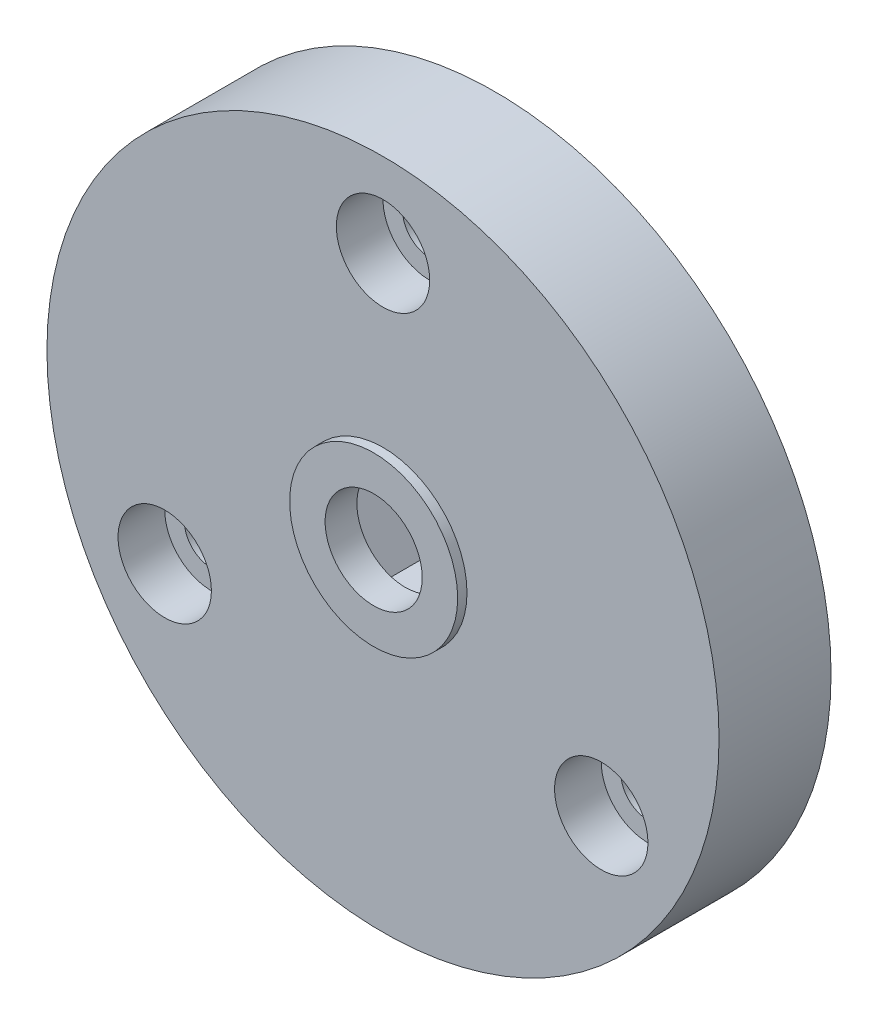
ISO-10303-21;
HEADER;
FILE_DESCRIPTION(('STEP AP214'),'2;1');
FILE_NAME('part.step','',(''),(''),'','','');
FILE_SCHEMA(('AUTOMOTIVE_DESIGN { 1 0 10303 214 1 1 1 1 }'));
ENDSEC;
DATA;
#1=APPLICATION_CONTEXT('core data for automotive mechanical design processes');
#2=APPLICATION_PROTOCOL_DEFINITION('international standard','automotive_design',2000,#1);
#3=PRODUCT_CONTEXT('',#1,'mechanical');
#4=PRODUCT('Part','Part','',(#3));
#5=PRODUCT_RELATED_PRODUCT_CATEGORY('part','',(#4));
#6=PRODUCT_DEFINITION_FORMATION('','',#4);
#7=PRODUCT_DEFINITION_CONTEXT('part definition',#1,'design');
#8=PRODUCT_DEFINITION('design','',#6,#7);
#9=PRODUCT_DEFINITION_SHAPE('','',#8);
#10=(LENGTH_UNIT() NAMED_UNIT(*) SI_UNIT(.MILLI.,.METRE.));
#11=(NAMED_UNIT(*) PLANE_ANGLE_UNIT() SI_UNIT($,.RADIAN.));
#12=(NAMED_UNIT(*) SI_UNIT($,.STERADIAN.) SOLID_ANGLE_UNIT());
#13=UNCERTAINTY_MEASURE_WITH_UNIT(LENGTH_MEASURE(1.E-05),#10,'distance_accuracy_value','');
#14=(GEOMETRIC_REPRESENTATION_CONTEXT(3) GLOBAL_UNCERTAINTY_ASSIGNED_CONTEXT((#13)) GLOBAL_UNIT_ASSIGNED_CONTEXT((#10,
#11,#12)) REPRESENTATION_CONTEXT('',''));
#15=CARTESIAN_POINT('',(0.,0.,0.));
#16=DIRECTION('',(0.,0.,1.));
#17=DIRECTION('',(1.,0.,0.));
#18=AXIS2_PLACEMENT_3D('',#15,#16,#17);
#19=CARTESIAN_POINT('',(300.,300.,328.));
#20=DIRECTION('',(0.,0.,1.));
#21=DIRECTION('',(1.,0.,0.));
#22=AXIS2_PLACEMENT_3D('',#19,#20,#21);
#23=PLANE('',#22);
#24=CARTESIAN_POINT('',(300.,300.,328.));
#25=DIRECTION('',(0.,0.,1.));
#26=DIRECTION('',(1.,0.,0.));
#27=AXIS2_PLACEMENT_3D('',#24,#25,#26);
#28=CIRCLE('',#27,18.);
#29=CARTESIAN_POINT('',(318.,300.,328.));
#30=VERTEX_POINT('',#29);
#31=EDGE_CURVE('E11',#30,#30,#28,.T.);
#32=ORIENTED_EDGE('',*,*,#31,.T.);
#33=EDGE_LOOP('',(#32));
#34=FACE_BOUND('',#33,.T.);
#35=CARTESIAN_POINT('',(311.69134295109,293.25,328.));
#36=DIRECTION('',(0.,0.,1.));
#37=DIRECTION('',(1.,0.,0.));
#38=AXIS2_PLACEMENT_3D('',#35,#36,#37);
#39=CIRCLE('',#38,2.5);
#40=CARTESIAN_POINT('',(314.19134295109,293.25,328.));
#41=VERTEX_POINT('',#40);
#42=EDGE_CURVE('E184',#41,#41,#39,.F.);
#43=ORIENTED_EDGE('',*,*,#42,.T.);
#44=EDGE_LOOP('',(#43));
#45=FACE_BOUND('',#44,.T.);
#46=CARTESIAN_POINT('',(288.30865704891,293.25,328.));
#47=DIRECTION('',(0.,0.,1.));
#48=DIRECTION('',(1.,0.,0.));
#49=AXIS2_PLACEMENT_3D('',#46,#47,#48);
#50=CIRCLE('',#49,2.5);
#51=CARTESIAN_POINT('',(290.80865704891,293.25,328.));
#52=VERTEX_POINT('',#51);
#53=EDGE_CURVE('E187',#52,#52,#50,.F.);
#54=ORIENTED_EDGE('',*,*,#53,.T.);
#55=EDGE_LOOP('',(#54));
#56=FACE_BOUND('',#55,.T.);
#57=CARTESIAN_POINT('',(300.,313.5,328.));
#58=DIRECTION('',(0.,0.,1.));
#59=DIRECTION('',(1.,0.,0.));
#60=AXIS2_PLACEMENT_3D('',#57,#58,#59);
#61=CIRCLE('',#60,2.5);
#62=CARTESIAN_POINT('',(302.5,313.5,328.));
#63=VERTEX_POINT('',#62);
#64=EDGE_CURVE('E168',#63,#63,#61,.F.);
#65=ORIENTED_EDGE('',*,*,#64,.T.);
#66=EDGE_LOOP('',(#65));
#67=FACE_BOUND('',#66,.T.);
#68=CARTESIAN_POINT('',(300.,300.,328.));
#69=DIRECTION('',(0.,0.,1.));
#70=DIRECTION('',(1.,0.,0.));
#71=AXIS2_PLACEMENT_3D('',#68,#69,#70);
#72=CIRCLE('',#71,4.5);
#73=CARTESIAN_POINT('',(304.5,300.,328.));
#74=VERTEX_POINT('',#73);
#75=EDGE_CURVE('E462',#74,#74,#72,.T.);
#76=ORIENTED_EDGE('',*,*,#75,.F.);
#77=EDGE_LOOP('',(#76));
#78=FACE_BOUND('',#77,.T.);
#79=ADVANCED_FACE('F39',(#34,#45,#56,#67,#78),#23,.T.);
#80=CARTESIAN_POINT('',(300.,300.,323.2));
#81=DIRECTION('',(0.,0.,1.));
#82=DIRECTION('',(1.,0.,0.));
#83=AXIS2_PLACEMENT_3D('',#80,#81,#82);
#84=PLANE('',#83);
#85=CARTESIAN_POINT('',(300.,300.,323.2));
#86=DIRECTION('',(0.,0.,1.));
#87=DIRECTION('',(1.,0.,0.));
#88=AXIS2_PLACEMENT_3D('',#85,#86,#87);
#89=CIRCLE('',#88,7.6);
#90=CARTESIAN_POINT('',(307.6,300.,323.2));
#91=VERTEX_POINT('',#90);
#92=EDGE_CURVE('E148',#91,#91,#89,.T.);
#93=ORIENTED_EDGE('',*,*,#92,.F.);
#94=EDGE_LOOP('',(#93));
#95=FACE_BOUND('',#94,.T.);
#96=DIRECTION('',(0.499999999999998,0.86602540378444,0.));
#97=VECTOR('',#96,1.);
#98=CARTESIAN_POINT('',(302.367136103677,295.9,323.2));
#99=LINE('',#98,#97);
#100=CARTESIAN_POINT('',(302.367136103677,295.9,323.2));
#101=VERTEX_POINT('',#100);
#102=CARTESIAN_POINT('',(304.734272207355,300.,323.2));
#103=VERTEX_POINT('',#102);
#104=EDGE_CURVE('E56',#101,#103,#99,.T.);
#105=ORIENTED_EDGE('',*,*,#104,.T.);
#106=DIRECTION('',(-0.499999999999993,0.866025403784443,0.));
#107=VECTOR('',#106,1.);
#108=CARTESIAN_POINT('',(304.734272207355,300.,323.2));
#109=LINE('',#108,#107);
#110=CARTESIAN_POINT('',(302.367136103677,304.1,323.2));
#111=VERTEX_POINT('',#110);
#112=EDGE_CURVE('E127',#103,#111,#109,.T.);
#113=ORIENTED_EDGE('',*,*,#112,.T.);
#114=DIRECTION('',(-1.,0.,0.));
#115=VECTOR('',#114,1.);
#116=CARTESIAN_POINT('',(302.367136103677,304.1,323.2));
#117=LINE('',#116,#115);
#118=CARTESIAN_POINT('',(297.632863896323,304.1,323.2));
#119=VERTEX_POINT('',#118);
#120=EDGE_CURVE('E131',#111,#119,#117,.T.);
#121=ORIENTED_EDGE('',*,*,#120,.T.);
#122=DIRECTION('',(-0.499999999999993,-0.866025403784443,0.));
#123=VECTOR('',#122,1.);
#124=CARTESIAN_POINT('',(297.632863896323,304.1,323.2));
#125=LINE('',#124,#123);
#126=CARTESIAN_POINT('',(295.265727792645,300.,323.2));
#127=VERTEX_POINT('',#126);
#128=EDGE_CURVE('E134',#119,#127,#125,.T.);
#129=ORIENTED_EDGE('',*,*,#128,.T.);
#130=DIRECTION('',(0.499999999999998,-0.86602540378444,0.));
#131=VECTOR('',#130,1.);
#132=CARTESIAN_POINT('',(295.265727792645,300.,323.2));
#133=LINE('',#132,#131);
#134=CARTESIAN_POINT('',(297.632863896323,295.9,323.2));
#135=VERTEX_POINT('',#134);
#136=EDGE_CURVE('E117',#127,#135,#133,.T.);
#137=ORIENTED_EDGE('',*,*,#136,.T.);
#138=DIRECTION('',(1.,0.,0.));
#139=VECTOR('',#138,1.);
#140=CARTESIAN_POINT('',(297.632863896323,295.9,323.2));
#141=LINE('',#140,#139);
#142=EDGE_CURVE('E137',#135,#101,#141,.T.);
#143=ORIENTED_EDGE('',*,*,#142,.T.);
#144=EDGE_LOOP('',(#105,#113,#121,#129,#137,#143));
#145=FACE_BOUND('',#144,.T.);
#146=ADVANCED_FACE('F215',(#95,#145),#84,.F.);
#147=CARTESIAN_POINT('',(300.,313.5,328.));
#148=DIRECTION('',(0.,0.,-1.));
#149=DIRECTION('',(-1.,0.,0.));
#150=AXIS2_PLACEMENT_3D('',#147,#148,#149);
#151=CYLINDRICAL_SURFACE('',#150,1.45000000000001);
#152=CARTESIAN_POINT('',(300.,313.5,322.));
#153=DIRECTION('',(0.,0.,1.));
#154=DIRECTION('',(1.,0.,0.));
#155=AXIS2_PLACEMENT_3D('',#152,#153,#154);
#156=CIRCLE('',#155,1.45000000000001);
#157=CARTESIAN_POINT('',(301.45,313.5,322.));
#158=VERTEX_POINT('',#157);
#159=EDGE_CURVE('E171',#158,#158,#156,.T.);
#160=ORIENTED_EDGE('',*,*,#159,.F.);
#161=EDGE_LOOP('',(#160));
#162=FACE_BOUND('',#161,.T.);
#163=CARTESIAN_POINT('',(300.,313.5,325.5));
#164=DIRECTION('',(0.,0.,1.));
#165=DIRECTION('',(1.,0.,0.));
#166=AXIS2_PLACEMENT_3D('',#163,#164,#165);
#167=CIRCLE('',#166,1.45000000000001);
#168=CARTESIAN_POINT('',(301.45,313.5,325.5));
#169=VERTEX_POINT('',#168);
#170=EDGE_CURVE('E181',#169,#169,#167,.T.);
#171=ORIENTED_EDGE('',*,*,#170,.T.);
#172=EDGE_LOOP('',(#171));
#173=FACE_BOUND('',#172,.T.);
#174=ADVANCED_FACE('F223',(#162,#173),#151,.F.);
#175=CARTESIAN_POINT('',(288.30865704891,293.25,328.));
#176=DIRECTION('',(0.,0.,-1.));
#177=DIRECTION('',(-1.,0.,0.));
#178=AXIS2_PLACEMENT_3D('',#175,#176,#177);
#179=CYLINDRICAL_SURFACE('',#178,1.45000000000001);
#180=CARTESIAN_POINT('',(288.30865704891,293.25,322.));
#181=DIRECTION('',(0.,0.,1.));
#182=DIRECTION('',(1.,0.,0.));
#183=AXIS2_PLACEMENT_3D('',#180,#181,#182);
#184=CIRCLE('',#183,1.45000000000001);
#185=CARTESIAN_POINT('',(289.75865704891,293.25,322.));
#186=VERTEX_POINT('',#185);
#187=EDGE_CURVE('E167',#186,#186,#184,.T.);
#188=ORIENTED_EDGE('',*,*,#187,.F.);
#189=EDGE_LOOP('',(#188));
#190=FACE_BOUND('',#189,.T.);
#191=CARTESIAN_POINT('',(288.30865704891,293.25,325.5));
#192=DIRECTION('',(0.,0.,1.));
#193=DIRECTION('',(1.,0.,0.));
#194=AXIS2_PLACEMENT_3D('',#191,#192,#193);
#195=CIRCLE('',#194,1.45000000000001);
#196=CARTESIAN_POINT('',(289.75865704891,293.25,325.5));
#197=VERTEX_POINT('',#196);
#198=EDGE_CURVE('E178',#197,#197,#195,.T.);
#199=ORIENTED_EDGE('',*,*,#198,.T.);
#200=EDGE_LOOP('',(#199));
#201=FACE_BOUND('',#200,.T.);
#202=ADVANCED_FACE('F238',(#190,#201),#179,.F.);
#203=CARTESIAN_POINT('',(311.69134295109,293.25,328.));
#204=DIRECTION('',(0.,0.,-1.));
#205=DIRECTION('',(-1.,0.,0.));
#206=AXIS2_PLACEMENT_3D('',#203,#204,#205);
#207=CYLINDRICAL_SURFACE('',#206,1.45000000000001);
#208=CARTESIAN_POINT('',(311.69134295109,293.25,322.));
#209=DIRECTION('',(0.,0.,1.));
#210=DIRECTION('',(1.,0.,0.));
#211=AXIS2_PLACEMENT_3D('',#208,#209,#210);
#212=CIRCLE('',#211,1.45000000000001);
#213=CARTESIAN_POINT('',(313.14134295109,293.25,322.));
#214=VERTEX_POINT('',#213);
#215=EDGE_CURVE('E164',#214,#214,#212,.T.);
#216=ORIENTED_EDGE('',*,*,#215,.F.);
#217=EDGE_LOOP('',(#216));
#218=FACE_BOUND('',#217,.T.);
#219=CARTESIAN_POINT('',(311.69134295109,293.25,325.5));
#220=DIRECTION('',(0.,0.,1.));
#221=DIRECTION('',(1.,0.,0.));
#222=AXIS2_PLACEMENT_3D('',#219,#220,#221);
#223=CIRCLE('',#222,1.45000000000001);
#224=CARTESIAN_POINT('',(313.14134295109,293.25,325.5));
#225=VERTEX_POINT('',#224);
#226=EDGE_CURVE('E158',#225,#225,#223,.T.);
#227=ORIENTED_EDGE('',*,*,#226,.T.);
#228=EDGE_LOOP('',(#227));
#229=FACE_BOUND('',#228,.T.);
#230=ADVANCED_FACE('F231',(#218,#229),#207,.F.);
#231=CARTESIAN_POINT('',(300.,300.,322.));
#232=DIRECTION('',(0.,0.,1.));
#233=DIRECTION('',(1.,0.,0.));
#234=AXIS2_PLACEMENT_3D('',#231,#232,#233);
#235=PLANE('',#234);
#236=CARTESIAN_POINT('',(300.,300.,322.));
#237=DIRECTION('',(0.,0.,1.));
#238=DIRECTION('',(1.,0.,0.));
#239=AXIS2_PLACEMENT_3D('',#236,#237,#238);
#240=CIRCLE('',#239,7.6);
#241=CARTESIAN_POINT('',(307.6,300.,322.));
#242=VERTEX_POINT('',#241);
#243=EDGE_CURVE('E152',#242,#242,#240,.T.);
#244=ORIENTED_EDGE('',*,*,#243,.T.);
#245=EDGE_LOOP('',(#244));
#246=FACE_BOUND('',#245,.T.);
#247=CARTESIAN_POINT('',(300.,300.,322.));
#248=DIRECTION('',(0.,0.,1.));
#249=DIRECTION('',(1.,0.,0.));
#250=AXIS2_PLACEMENT_3D('',#247,#248,#249);
#251=CIRCLE('',#250,18.);
#252=CARTESIAN_POINT('',(318.,300.,322.));
#253=VERTEX_POINT('',#252);
#254=EDGE_CURVE('E48',#253,#253,#251,.T.);
#255=ORIENTED_EDGE('',*,*,#254,.F.);
#256=EDGE_LOOP('',(#255));
#257=FACE_BOUND('',#256,.T.);
#258=ORIENTED_EDGE('',*,*,#159,.T.);
#259=EDGE_LOOP('',(#258));
#260=FACE_BOUND('',#259,.T.);
#261=ORIENTED_EDGE('',*,*,#187,.T.);
#262=EDGE_LOOP('',(#261));
#263=FACE_BOUND('',#262,.T.);
#264=ORIENTED_EDGE('',*,*,#215,.T.);
#265=EDGE_LOOP('',(#264));
#266=FACE_BOUND('',#265,.T.);
#267=ADVANCED_FACE('F230',(#246,#257,#260,#263,#266),#235,.F.);
#268=CARTESIAN_POINT('',(300.,300.,328.));
#269=DIRECTION('',(0.,0.,-1.));
#270=DIRECTION('',(-1.,0.,0.));
#271=AXIS2_PLACEMENT_3D('',#268,#269,#270);
#272=CYLINDRICAL_SURFACE('',#271,18.);
#273=ORIENTED_EDGE('',*,*,#31,.F.);
#274=EDGE_LOOP('',(#273));
#275=FACE_BOUND('',#274,.T.);
#276=ORIENTED_EDGE('',*,*,#254,.T.);
#277=EDGE_LOOP('',(#276));
#278=FACE_BOUND('',#277,.T.);
#279=ADVANCED_FACE('F41',(#275,#278),#272,.T.);
#280=CARTESIAN_POINT('',(300.,300.,328.));
#281=DIRECTION('',(0.,0.,-1.));
#282=DIRECTION('',(-1.,0.,0.));
#283=AXIS2_PLACEMENT_3D('',#280,#281,#282);
#284=CYLINDRICAL_SURFACE('',#283,2.59999999999999);
#285=CARTESIAN_POINT('',(300.,300.,326.8));
#286=DIRECTION('',(0.,0.,1.));
#287=DIRECTION('',(1.,0.,0.));
#288=AXIS2_PLACEMENT_3D('',#285,#286,#287);
#289=CIRCLE('',#288,2.59999999999999);
#290=CARTESIAN_POINT('',(302.6,300.,326.8));
#291=VERTEX_POINT('',#290);
#292=EDGE_CURVE('E43',#291,#291,#289,.T.);
#293=ORIENTED_EDGE('',*,*,#292,.F.);
#294=EDGE_LOOP('',(#293));
#295=FACE_BOUND('',#294,.T.);
#296=CARTESIAN_POINT('',(300.,300.,328.5));
#297=DIRECTION('',(0.,0.,1.));
#298=DIRECTION('',(1.,0.,0.));
#299=AXIS2_PLACEMENT_3D('',#296,#297,#298);
#300=CIRCLE('',#299,2.59999999999999);
#301=CARTESIAN_POINT('',(302.6,300.,328.5));
#302=VERTEX_POINT('',#301);
#303=EDGE_CURVE('E465',#302,#302,#300,.T.);
#304=ORIENTED_EDGE('',*,*,#303,.T.);
#305=EDGE_LOOP('',(#304));
#306=FACE_BOUND('',#305,.T.);
#307=ADVANCED_FACE('F228',(#295,#306),#284,.F.);
#308=CARTESIAN_POINT('',(311.69134295109,293.25,328.01));
#309=DIRECTION('',(0.,0.,-1.));
#310=DIRECTION('',(-1.,0.,0.));
#311=AXIS2_PLACEMENT_3D('',#308,#309,#310);
#312=CYLINDRICAL_SURFACE('',#311,2.5);
#313=ORIENTED_EDGE('',*,*,#42,.F.);
#314=EDGE_LOOP('',(#313));
#315=FACE_BOUND('',#314,.T.);
#316=CARTESIAN_POINT('',(311.69134295109,293.25,325.5));
#317=DIRECTION('',(0.,0.,1.));
#318=DIRECTION('',(1.,0.,0.));
#319=AXIS2_PLACEMENT_3D('',#316,#317,#318);
#320=CIRCLE('',#319,2.5);
#321=CARTESIAN_POINT('',(314.19134295109,293.25,325.5));
#322=VERTEX_POINT('',#321);
#323=EDGE_CURVE('E151',#322,#322,#320,.T.);
#324=ORIENTED_EDGE('',*,*,#323,.F.);
#325=EDGE_LOOP('',(#324));
#326=FACE_BOUND('',#325,.T.);
#327=ADVANCED_FACE('F257',(#315,#326),#312,.F.);
#328=CARTESIAN_POINT('',(311.69134295109,293.25,325.5));
#329=DIRECTION('',(0.,0.,1.));
#330=DIRECTION('',(1.,0.,0.));
#331=AXIS2_PLACEMENT_3D('',#328,#329,#330);
#332=PLANE('',#331);
#333=ORIENTED_EDGE('',*,*,#226,.F.);
#334=EDGE_LOOP('',(#333));
#335=FACE_BOUND('',#334,.T.);
#336=ORIENTED_EDGE('',*,*,#323,.T.);
#337=EDGE_LOOP('',(#336));
#338=FACE_BOUND('',#337,.T.);
#339=ADVANCED_FACE('F253',(#335,#338),#332,.T.);
#340=CARTESIAN_POINT('',(288.30865704891,293.25,328.01));
#341=DIRECTION('',(0.,0.,-1.));
#342=DIRECTION('',(-1.,0.,0.));
#343=AXIS2_PLACEMENT_3D('',#340,#341,#342);
#344=CYLINDRICAL_SURFACE('',#343,2.5);
#345=ORIENTED_EDGE('',*,*,#53,.F.);
#346=EDGE_LOOP('',(#345));
#347=FACE_BOUND('',#346,.T.);
#348=CARTESIAN_POINT('',(288.30865704891,293.25,325.5));
#349=DIRECTION('',(0.,0.,1.));
#350=DIRECTION('',(1.,0.,0.));
#351=AXIS2_PLACEMENT_3D('',#348,#349,#350);
#352=CIRCLE('',#351,2.5);
#353=CARTESIAN_POINT('',(290.80865704891,293.25,325.5));
#354=VERTEX_POINT('',#353);
#355=EDGE_CURVE('E159',#354,#354,#352,.T.);
#356=ORIENTED_EDGE('',*,*,#355,.F.);
#357=EDGE_LOOP('',(#356));
#358=FACE_BOUND('',#357,.T.);
#359=ADVANCED_FACE('F256',(#347,#358),#344,.F.);
#360=CARTESIAN_POINT('',(288.30865704891,293.25,325.5));
#361=DIRECTION('',(0.,0.,1.));
#362=DIRECTION('',(1.,0.,0.));
#363=AXIS2_PLACEMENT_3D('',#360,#361,#362);
#364=PLANE('',#363);
#365=ORIENTED_EDGE('',*,*,#198,.F.);
#366=EDGE_LOOP('',(#365));
#367=FACE_BOUND('',#366,.T.);
#368=ORIENTED_EDGE('',*,*,#355,.T.);
#369=EDGE_LOOP('',(#368));
#370=FACE_BOUND('',#369,.T.);
#371=ADVANCED_FACE('F198',(#367,#370),#364,.T.);
#372=CARTESIAN_POINT('',(300.,313.5,328.01));
#373=DIRECTION('',(0.,0.,-1.));
#374=DIRECTION('',(-1.,0.,0.));
#375=AXIS2_PLACEMENT_3D('',#372,#373,#374);
#376=CYLINDRICAL_SURFACE('',#375,2.5);
#377=ORIENTED_EDGE('',*,*,#64,.F.);
#378=EDGE_LOOP('',(#377));
#379=FACE_BOUND('',#378,.T.);
#380=CARTESIAN_POINT('',(300.,313.5,325.5));
#381=DIRECTION('',(0.,0.,1.));
#382=DIRECTION('',(1.,0.,0.));
#383=AXIS2_PLACEMENT_3D('',#380,#381,#382);
#384=CIRCLE('',#383,2.5);
#385=CARTESIAN_POINT('',(302.5,313.5,325.5));
#386=VERTEX_POINT('',#385);
#387=EDGE_CURVE('E155',#386,#386,#384,.T.);
#388=ORIENTED_EDGE('',*,*,#387,.F.);
#389=EDGE_LOOP('',(#388));
#390=FACE_BOUND('',#389,.T.);
#391=ADVANCED_FACE('F194',(#379,#390),#376,.F.);
#392=CARTESIAN_POINT('',(300.,313.5,325.5));
#393=DIRECTION('',(0.,0.,1.));
#394=DIRECTION('',(1.,0.,0.));
#395=AXIS2_PLACEMENT_3D('',#392,#393,#394);
#396=PLANE('',#395);
#397=ORIENTED_EDGE('',*,*,#170,.F.);
#398=EDGE_LOOP('',(#397));
#399=FACE_BOUND('',#398,.T.);
#400=ORIENTED_EDGE('',*,*,#387,.T.);
#401=EDGE_LOOP('',(#400));
#402=FACE_BOUND('',#401,.T.);
#403=ADVANCED_FACE('F197',(#399,#402),#396,.T.);
#404=CARTESIAN_POINT('',(300.,300.,323.2));
#405=DIRECTION('',(0.,0.,-1.));
#406=DIRECTION('',(-1.,0.,0.));
#407=AXIS2_PLACEMENT_3D('',#404,#405,#406);
#408=CYLINDRICAL_SURFACE('',#407,7.6);
#409=ORIENTED_EDGE('',*,*,#92,.T.);
#410=EDGE_LOOP('',(#409));
#411=FACE_BOUND('',#410,.T.);
#412=ORIENTED_EDGE('',*,*,#243,.F.);
#413=EDGE_LOOP('',(#412));
#414=FACE_BOUND('',#413,.T.);
#415=ADVANCED_FACE('F203',(#411,#414),#408,.F.);
#416=CARTESIAN_POINT('',(302.367136103677,295.9,326.8));
#417=DIRECTION('',(-0.86602540378444,0.499999999999998,0.));
#418=DIRECTION('',(-0.499999999999998,-0.86602540378444,0.));
#419=AXIS2_PLACEMENT_3D('',#416,#417,#418);
#420=PLANE('',#419);
#421=ORIENTED_EDGE('',*,*,#104,.F.);
#422=DIRECTION('',(0.,0.,-1.));
#423=VECTOR('',#422,1.);
#424=CARTESIAN_POINT('',(302.367136103677,295.9,326.8));
#425=LINE('',#424,#423);
#426=CARTESIAN_POINT('',(302.367136103677,295.9,326.8));
#427=VERTEX_POINT('',#426);
#428=EDGE_CURVE('E122',#427,#101,#425,.T.);
#429=ORIENTED_EDGE('',*,*,#428,.F.);
#430=DIRECTION('',(0.499999999999998,0.86602540378444,0.));
#431=VECTOR('',#430,1.);
#432=CARTESIAN_POINT('',(302.367136103677,295.9,326.8));
#433=LINE('',#432,#431);
#434=CARTESIAN_POINT('',(304.734272207355,300.,326.8));
#435=VERTEX_POINT('',#434);
#436=EDGE_CURVE('E140',#427,#435,#433,.T.);
#437=ORIENTED_EDGE('',*,*,#436,.T.);
#438=DIRECTION('',(0.,0.,-1.));
#439=VECTOR('',#438,1.);
#440=CARTESIAN_POINT('',(304.734272207355,300.,326.8));
#441=LINE('',#440,#439);
#442=EDGE_CURVE('E146',#435,#103,#441,.T.);
#443=ORIENTED_EDGE('',*,*,#442,.T.);
#444=EDGE_LOOP('',(#421,#429,#437,#443));
#445=FACE_BOUND('',#444,.T.);
#446=ADVANCED_FACE('F210',(#445),#420,.T.);
#447=CARTESIAN_POINT('',(304.734272207355,300.,326.8));
#448=DIRECTION('',(-0.866025403784443,-0.499999999999993,0.));
#449=DIRECTION('',(0.499999999999993,-0.866025403784443,0.));
#450=AXIS2_PLACEMENT_3D('',#447,#448,#449);
#451=PLANE('',#450);
#452=ORIENTED_EDGE('',*,*,#112,.F.);
#453=ORIENTED_EDGE('',*,*,#442,.F.);
#454=DIRECTION('',(-0.499999999999993,0.866025403784443,0.));
#455=VECTOR('',#454,1.);
#456=CARTESIAN_POINT('',(304.734272207355,300.,326.8));
#457=LINE('',#456,#455);
#458=CARTESIAN_POINT('',(302.367136103677,304.1,326.8));
#459=VERTEX_POINT('',#458);
#460=EDGE_CURVE('E95',#435,#459,#457,.T.);
#461=ORIENTED_EDGE('',*,*,#460,.T.);
#462=DIRECTION('',(0.,0.,-1.));
#463=VECTOR('',#462,1.);
#464=CARTESIAN_POINT('',(302.367136103677,304.1,326.8));
#465=LINE('',#464,#463);
#466=EDGE_CURVE('E144',#459,#111,#465,.T.);
#467=ORIENTED_EDGE('',*,*,#466,.T.);
#468=EDGE_LOOP('',(#452,#453,#461,#467));
#469=FACE_BOUND('',#468,.T.);
#470=ADVANCED_FACE('F349',(#469),#451,.T.);
#471=CARTESIAN_POINT('',(302.367136103677,304.1,326.8));
#472=DIRECTION('',(0.,-1.,0.));
#473=DIRECTION('',(0.,0.,-1.));
#474=AXIS2_PLACEMENT_3D('',#471,#472,#473);
#475=PLANE('',#474);
#476=ORIENTED_EDGE('',*,*,#120,.F.);
#477=ORIENTED_EDGE('',*,*,#466,.F.);
#478=DIRECTION('',(-1.,0.,0.));
#479=VECTOR('',#478,1.);
#480=CARTESIAN_POINT('',(302.367136103677,304.1,326.8));
#481=LINE('',#480,#479);
#482=CARTESIAN_POINT('',(297.632863896323,304.1,326.8));
#483=VERTEX_POINT('',#482);
#484=EDGE_CURVE('E113',#459,#483,#481,.T.);
#485=ORIENTED_EDGE('',*,*,#484,.T.);
#486=DIRECTION('',(0.,0.,-1.));
#487=VECTOR('',#486,1.);
#488=CARTESIAN_POINT('',(297.632863896323,304.1,326.8));
#489=LINE('',#488,#487);
#490=EDGE_CURVE('E110',#483,#119,#489,.T.);
#491=ORIENTED_EDGE('',*,*,#490,.T.);
#492=EDGE_LOOP('',(#476,#477,#485,#491));
#493=FACE_BOUND('',#492,.T.);
#494=ADVANCED_FACE('F346',(#493),#475,.T.);
#495=CARTESIAN_POINT('',(297.632863896323,304.1,326.8));
#496=DIRECTION('',(0.866025403784443,-0.499999999999993,0.));
#497=DIRECTION('',(0.499999999999993,0.866025403784443,0.));
#498=AXIS2_PLACEMENT_3D('',#495,#496,#497);
#499=PLANE('',#498);
#500=ORIENTED_EDGE('',*,*,#128,.F.);
#501=ORIENTED_EDGE('',*,*,#490,.F.);
#502=DIRECTION('',(-0.499999999999993,-0.866025403784443,0.));
#503=VECTOR('',#502,1.);
#504=CARTESIAN_POINT('',(297.632863896323,304.1,326.8));
#505=LINE('',#504,#503);
#506=CARTESIAN_POINT('',(295.265727792645,300.,326.8));
#507=VERTEX_POINT('',#506);
#508=EDGE_CURVE('E105',#483,#507,#505,.T.);
#509=ORIENTED_EDGE('',*,*,#508,.T.);
#510=DIRECTION('',(0.,0.,-1.));
#511=VECTOR('',#510,1.);
#512=CARTESIAN_POINT('',(295.265727792645,300.,326.8));
#513=LINE('',#512,#511);
#514=EDGE_CURVE('E109',#507,#127,#513,.T.);
#515=ORIENTED_EDGE('',*,*,#514,.T.);
#516=EDGE_LOOP('',(#500,#501,#509,#515));
#517=FACE_BOUND('',#516,.T.);
#518=ADVANCED_FACE('F108',(#517),#499,.T.);
#519=CARTESIAN_POINT('',(295.265727792645,300.,326.8));
#520=DIRECTION('',(0.86602540378444,0.499999999999998,0.));
#521=DIRECTION('',(-0.499999999999998,0.86602540378444,0.));
#522=AXIS2_PLACEMENT_3D('',#519,#520,#521);
#523=PLANE('',#522);
#524=ORIENTED_EDGE('',*,*,#136,.F.);
#525=ORIENTED_EDGE('',*,*,#514,.F.);
#526=DIRECTION('',(0.499999999999998,-0.86602540378444,0.));
#527=VECTOR('',#526,1.);
#528=CARTESIAN_POINT('',(295.265727792645,300.,326.8));
#529=LINE('',#528,#527);
#530=CARTESIAN_POINT('',(297.632863896323,295.9,326.8));
#531=VERTEX_POINT('',#530);
#532=EDGE_CURVE('E112',#507,#531,#529,.T.);
#533=ORIENTED_EDGE('',*,*,#532,.T.);
#534=DIRECTION('',(0.,0.,-1.));
#535=VECTOR('',#534,1.);
#536=CARTESIAN_POINT('',(297.632863896323,295.9,326.8));
#537=LINE('',#536,#535);
#538=EDGE_CURVE('E86',#531,#135,#537,.T.);
#539=ORIENTED_EDGE('',*,*,#538,.T.);
#540=EDGE_LOOP('',(#524,#525,#533,#539));
#541=FACE_BOUND('',#540,.T.);
#542=ADVANCED_FACE('F115',(#541),#523,.T.);
#543=CARTESIAN_POINT('',(297.632863896323,295.9,326.8));
#544=DIRECTION('',(0.,1.,0.));
#545=DIRECTION('',(0.,0.,1.));
#546=AXIS2_PLACEMENT_3D('',#543,#544,#545);
#547=PLANE('',#546);
#548=ORIENTED_EDGE('',*,*,#142,.F.);
#549=ORIENTED_EDGE('',*,*,#538,.F.);
#550=DIRECTION('',(1.,0.,0.));
#551=VECTOR('',#550,1.);
#552=CARTESIAN_POINT('',(297.632863896323,295.9,326.8));
#553=LINE('',#552,#551);
#554=EDGE_CURVE('E64',#531,#427,#553,.T.);
#555=ORIENTED_EDGE('',*,*,#554,.T.);
#556=ORIENTED_EDGE('',*,*,#428,.T.);
#557=EDGE_LOOP('',(#548,#549,#555,#556));
#558=FACE_BOUND('',#557,.T.);
#559=ADVANCED_FACE('F338',(#558),#547,.T.);
#560=CARTESIAN_POINT('',(0.,0.,326.8));
#561=DIRECTION('',(0.,0.,1.));
#562=DIRECTION('',(1.,0.,0.));
#563=AXIS2_PLACEMENT_3D('',#560,#561,#562);
#564=PLANE('',#563);
#565=ORIENTED_EDGE('',*,*,#292,.T.);
#566=EDGE_LOOP('',(#565));
#567=FACE_BOUND('',#566,.T.);
#568=ORIENTED_EDGE('',*,*,#436,.F.);
#569=ORIENTED_EDGE('',*,*,#554,.F.);
#570=ORIENTED_EDGE('',*,*,#532,.F.);
#571=ORIENTED_EDGE('',*,*,#508,.F.);
#572=ORIENTED_EDGE('',*,*,#484,.F.);
#573=ORIENTED_EDGE('',*,*,#460,.F.);
#574=EDGE_LOOP('',(#568,#569,#570,#571,#572,#573));
#575=FACE_BOUND('',#574,.T.);
#576=ADVANCED_FACE('F120',(#567,#575),#564,.F.);
#577=CARTESIAN_POINT('',(300.,300.,328.5));
#578=DIRECTION('',(0.,0.,1.));
#579=DIRECTION('',(1.,0.,0.));
#580=AXIS2_PLACEMENT_3D('',#577,#578,#579);
#581=PLANE('',#580);
#582=CARTESIAN_POINT('',(300.,300.,328.5));
#583=DIRECTION('',(0.,0.,1.));
#584=DIRECTION('',(1.,0.,0.));
#585=AXIS2_PLACEMENT_3D('',#582,#583,#584);
#586=CIRCLE('',#585,4.5);
#587=CARTESIAN_POINT('',(304.5,300.,328.5));
#588=VERTEX_POINT('',#587);
#589=EDGE_CURVE('E128',#588,#588,#586,.T.);
#590=ORIENTED_EDGE('',*,*,#589,.T.);
#591=EDGE_LOOP('',(#590));
#592=FACE_BOUND('',#591,.T.);
#593=ORIENTED_EDGE('',*,*,#303,.F.);
#594=EDGE_LOOP('',(#593));
#595=FACE_BOUND('',#594,.T.);
#596=ADVANCED_FACE('F316',(#592,#595),#581,.T.);
#597=CARTESIAN_POINT('',(300.,300.,328.5));
#598=DIRECTION('',(0.,0.,-1.));
#599=DIRECTION('',(-1.,0.,0.));
#600=AXIS2_PLACEMENT_3D('',#597,#598,#599);
#601=CYLINDRICAL_SURFACE('',#600,4.5);
#602=ORIENTED_EDGE('',*,*,#589,.F.);
#603=EDGE_LOOP('',(#602));
#604=FACE_BOUND('',#603,.T.);
#605=ORIENTED_EDGE('',*,*,#75,.T.);
#606=EDGE_LOOP('',(#605));
#607=FACE_BOUND('',#606,.T.);
#608=ADVANCED_FACE('F321',(#604,#607),#601,.T.);
#609=CLOSED_SHELL('',(#79,#146,#174,#202,#230,#267,#279,#307,#327,#339,#359,#371,#391,#403,#415,
#446,#470,#494,#518,#542,#559,#576,#596,#608));
#610=MANIFOLD_SOLID_BREP('B2',#609);
#611=ADVANCED_BREP_SHAPE_REPRESENTATION('',(#18,#610),#14);
#612=SHAPE_DEFINITION_REPRESENTATION(#9,#611);
ENDSEC;
END-ISO-10303-21;
